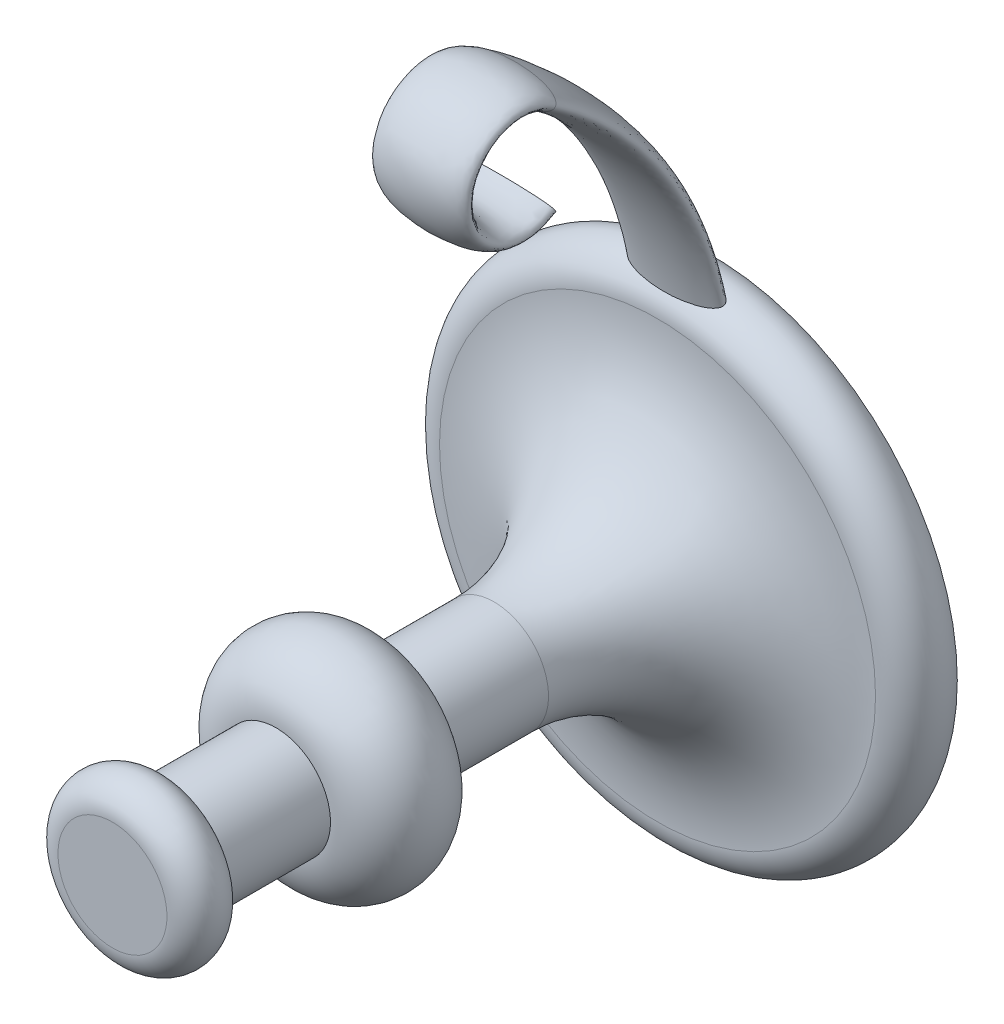
ISO-10303-21;
HEADER;
FILE_DESCRIPTION(('STEP AP214'),'2;1');
FILE_NAME('part.step','',(''),(''),'','','');
FILE_SCHEMA(('AUTOMOTIVE_DESIGN { 1 0 10303 214 1 1 1 1 }'));
ENDSEC;
DATA;
#1=APPLICATION_CONTEXT('core data for automotive mechanical design processes');
#2=APPLICATION_PROTOCOL_DEFINITION('international standard','automotive_design',2000,#1);
#3=PRODUCT_CONTEXT('',#1,'mechanical');
#4=PRODUCT('Part','Part','',(#3));
#5=PRODUCT_RELATED_PRODUCT_CATEGORY('part','',(#4));
#6=PRODUCT_DEFINITION_FORMATION('','',#4);
#7=PRODUCT_DEFINITION_CONTEXT('part definition',#1,'design');
#8=PRODUCT_DEFINITION('design','',#6,#7);
#9=PRODUCT_DEFINITION_SHAPE('','',#8);
#10=(LENGTH_UNIT() NAMED_UNIT(*) SI_UNIT(.MILLI.,.METRE.));
#11=(NAMED_UNIT(*) PLANE_ANGLE_UNIT() SI_UNIT($,.RADIAN.));
#12=(NAMED_UNIT(*) SI_UNIT($,.STERADIAN.) SOLID_ANGLE_UNIT());
#13=UNCERTAINTY_MEASURE_WITH_UNIT(LENGTH_MEASURE(1.E-05),#10,'distance_accuracy_value','');
#14=(GEOMETRIC_REPRESENTATION_CONTEXT(3) GLOBAL_UNCERTAINTY_ASSIGNED_CONTEXT((#13)) GLOBAL_UNIT_ASSIGNED_CONTEXT((#10,
#11,#12)) REPRESENTATION_CONTEXT('',''));
#15=CARTESIAN_POINT('',(0.,0.,0.));
#16=DIRECTION('',(0.,0.,1.));
#17=DIRECTION('',(1.,0.,0.));
#18=AXIS2_PLACEMENT_3D('',#15,#16,#17);
#19=CARTESIAN_POINT('',(0.,0.,0.));
#20=DIRECTION('',(0.,0.,-1.));
#21=DIRECTION('',(-1.,0.,0.));
#22=AXIS2_PLACEMENT_3D('',#19,#20,#21);
#23=PLANE('',#22);
#24=CARTESIAN_POINT('',(0.,0.,0.));
#25=DIRECTION('',(0.,0.,-1.));
#26=DIRECTION('',(-1.,0.,0.));
#27=AXIS2_PLACEMENT_3D('',#24,#25,#26);
#28=CIRCLE('',#27,90.);
#29=CARTESIAN_POINT('',(-90.,0.,0.));
#30=VERTEX_POINT('',#29);
#31=EDGE_CURVE('E72',#30,#30,#28,.T.);
#32=ORIENTED_EDGE('',*,*,#31,.T.);
#33=EDGE_LOOP('',(#32));
#34=FACE_BOUND('',#33,.T.);
#35=ADVANCED_FACE('F39',(#34),#23,.T.);
#36=CARTESIAN_POINT('',(0.,0.,220.));
#37=DIRECTION('',(0.,0.,1.));
#38=DIRECTION('',(1.,0.,0.));
#39=AXIS2_PLACEMENT_3D('',#36,#37,#38);
#40=PLANE('',#39);
#41=CARTESIAN_POINT('',(0.,0.,220.));
#42=DIRECTION('',(0.,0.,-1.));
#43=DIRECTION('',(-1.,0.,0.));
#44=AXIS2_PLACEMENT_3D('',#41,#42,#43);
#45=CIRCLE('',#44,20.);
#46=CARTESIAN_POINT('',(-20.,0.,220.));
#47=VERTEX_POINT('',#46);
#48=EDGE_CURVE('E50',#47,#47,#45,.T.);
#49=ORIENTED_EDGE('',*,*,#48,.F.);
#50=EDGE_LOOP('',(#49));
#51=FACE_BOUND('',#50,.T.);
#52=ADVANCED_FACE('F100',(#51),#40,.T.);
#53=CARTESIAN_POINT('',(0.,0.,210.));
#54=DIRECTION('',(0.,0.,-1.));
#55=DIRECTION('',(-1.,0.,0.));
#56=AXIS2_PLACEMENT_3D('',#53,#54,#55);
#57=TOROIDAL_SURFACE('',#56,20.,10.);
#58=ORIENTED_EDGE('',*,*,#48,.T.);
#59=EDGE_LOOP('',(#58));
#60=FACE_BOUND('',#59,.T.);
#61=CARTESIAN_POINT('',(0.,0.,200.));
#62=DIRECTION('',(0.,0.,-1.));
#63=DIRECTION('',(-1.,0.,0.));
#64=AXIS2_PLACEMENT_3D('',#61,#62,#63);
#65=CIRCLE('',#64,20.);
#66=CARTESIAN_POINT('',(-20.,0.,200.));
#67=VERTEX_POINT('',#66);
#68=EDGE_CURVE('E54',#67,#67,#65,.T.);
#69=ORIENTED_EDGE('',*,*,#68,.F.);
#70=EDGE_LOOP('',(#69));
#71=FACE_BOUND('',#70,.T.);
#72=ADVANCED_FACE('F105',(#60,#71),#57,.T.);
#73=CARTESIAN_POINT('',(0.,0.,0.));
#74=DIRECTION('',(0.,0.,-1.));
#75=DIRECTION('',(-1.,0.,0.));
#76=AXIS2_PLACEMENT_3D('',#73,#74,#75);
#77=CYLINDRICAL_SURFACE('',#76,20.);
#78=ORIENTED_EDGE('',*,*,#68,.T.);
#79=EDGE_LOOP('',(#78));
#80=FACE_BOUND('',#79,.T.);
#81=CARTESIAN_POINT('',(0.,0.,160.));
#82=DIRECTION('',(0.,0.,-1.));
#83=DIRECTION('',(-1.,0.,0.));
#84=AXIS2_PLACEMENT_3D('',#81,#82,#83);
#85=CIRCLE('',#84,20.);
#86=CARTESIAN_POINT('',(-20.,0.,160.));
#87=VERTEX_POINT('',#86);
#88=EDGE_CURVE('E58',#87,#87,#85,.T.);
#89=ORIENTED_EDGE('',*,*,#88,.F.);
#90=EDGE_LOOP('',(#89));
#91=FACE_BOUND('',#90,.T.);
#92=ADVANCED_FACE('F127',(#80,#91),#77,.T.);
#93=CARTESIAN_POINT('',(0.,0.,140.));
#94=DIRECTION('',(0.,0.,-1.));
#95=DIRECTION('',(-1.,0.,0.));
#96=AXIS2_PLACEMENT_3D('',#93,#94,#95);
#97=TOROIDAL_SURFACE('',#96,20.,20.);
#98=ORIENTED_EDGE('',*,*,#88,.T.);
#99=EDGE_LOOP('',(#98));
#100=FACE_BOUND('',#99,.T.);
#101=CARTESIAN_POINT('',(0.,0.,120.));
#102=DIRECTION('',(0.,0.,-1.));
#103=DIRECTION('',(-1.,0.,0.));
#104=AXIS2_PLACEMENT_3D('',#101,#102,#103);
#105=CIRCLE('',#104,20.);
#106=CARTESIAN_POINT('',(-20.,0.,120.));
#107=VERTEX_POINT('',#106);
#108=EDGE_CURVE('E63',#107,#107,#105,.T.);
#109=ORIENTED_EDGE('',*,*,#108,.F.);
#110=EDGE_LOOP('',(#109));
#111=FACE_BOUND('',#110,.T.);
#112=ADVANCED_FACE('F123',(#100,#111),#97,.T.);
#113=CARTESIAN_POINT('',(0.,0.,0.));
#114=DIRECTION('',(0.,0.,-1.));
#115=DIRECTION('',(-1.,0.,0.));
#116=AXIS2_PLACEMENT_3D('',#113,#114,#115);
#117=CYLINDRICAL_SURFACE('',#116,20.);
#118=ORIENTED_EDGE('',*,*,#108,.T.);
#119=EDGE_LOOP('',(#118));
#120=FACE_BOUND('',#119,.T.);
#121=CARTESIAN_POINT('',(0.,0.,80.));
#122=DIRECTION('',(0.,0.,-1.));
#123=DIRECTION('',(-1.,0.,0.));
#124=AXIS2_PLACEMENT_3D('',#121,#122,#123);
#125=CIRCLE('',#124,20.);
#126=CARTESIAN_POINT('',(-20.,0.,80.));
#127=VERTEX_POINT('',#126);
#128=EDGE_CURVE('E66',#127,#127,#125,.T.);
#129=ORIENTED_EDGE('',*,*,#128,.F.);
#130=EDGE_LOOP('',(#129));
#131=FACE_BOUND('',#130,.T.);
#132=ADVANCED_FACE('F115',(#120,#131),#117,.T.);
#133=CARTESIAN_POINT('',(0.,0.,80.));
#134=DIRECTION('',(0.,0.,-1.));
#135=DIRECTION('',(-1.,0.,0.));
#136=AXIS2_PLACEMENT_3D('',#133,#134,#135);
#137=TOROIDAL_SURFACE('',#136,80.,60.);
#138=ORIENTED_EDGE('',*,*,#128,.T.);
#139=EDGE_LOOP('',(#138));
#140=FACE_BOUND('',#139,.T.);
#141=CARTESIAN_POINT('',(0.,0.,20.));
#142=DIRECTION('',(0.,0.,-1.));
#143=DIRECTION('',(-1.,0.,0.));
#144=AXIS2_PLACEMENT_3D('',#141,#142,#143);
#145=CIRCLE('',#144,80.);
#146=CARTESIAN_POINT('',(-80.,0.,20.));
#147=VERTEX_POINT('',#146);
#148=EDGE_CURVE('E69',#147,#147,#145,.T.);
#149=ORIENTED_EDGE('',*,*,#148,.F.);
#150=EDGE_LOOP('',(#149));
#151=FACE_BOUND('',#150,.T.);
#152=ADVANCED_FACE('F110',(#140,#151),#137,.F.);
#153=CARTESIAN_POINT('',(0.,0.,7.50000000000004));
#154=DIRECTION('',(0.,0.,-1.));
#155=DIRECTION('',(-1.,0.,0.));
#156=AXIS2_PLACEMENT_3D('',#153,#154,#155);
#157=TOROIDAL_SURFACE('',#156,80.,12.5);
#158=CARTESIAN_POINT('',(17.5,89.5597422043342,12.9414346567555));
#159=CARTESIAN_POINT('',(17.5000019534777,89.5807278946486,12.8988393157081));
#160=CARTESIAN_POINT('',(17.4977816975197,89.6018125795404,12.8563039357769));
#161=CARTESIAN_POINT('',(17.489002543543,89.6440155813562,12.771693833937));
#162=CARTESIAN_POINT('',(17.4824425050804,89.6651339056647,12.7296192360718));
#163=CARTESIAN_POINT('',(17.4565216692095,89.728328929782,12.6045076597417));
#164=CARTESIAN_POINT('',(17.4309204730635,89.7702246464786,12.5226255894255));
#165=CARTESIAN_POINT('',(17.3563532007827,89.8644276523312,12.3407735771966));
#166=CARTESIAN_POINT('',(17.3027527423027,89.916211748319,12.242484901666));
#167=CARTESIAN_POINT('',(17.178826321144,90.0163878681401,12.0551458272008));
#168=CARTESIAN_POINT('',(17.1084587296402,90.0647710548456,11.966119226993));
#169=CARTESIAN_POINT('',(16.9652391551481,90.1524531790239,11.806984522925));
#170=CARTESIAN_POINT('',(16.8936963434585,90.1921458014336,11.7358878994478));
#171=CARTESIAN_POINT('',(16.7438969488311,90.2690886261225,11.5996259068224));
#172=CARTESIAN_POINT('',(16.665634722265,90.3063367280021,11.5344656201532));
#173=CARTESIAN_POINT('',(16.5039763875564,90.3786756485819,11.4092540815105));
#174=CARTESIAN_POINT('',(16.4205713158719,90.4137624747615,11.349212210629));
#175=CARTESIAN_POINT('',(16.2499454917114,90.4819450166471,11.2336894025402));
#176=CARTESIAN_POINT('',(16.162725848809,90.5150413047902,11.1782071523835));
#177=CARTESIAN_POINT('',(15.9728919395736,90.5839705930101,11.0637251825689));
#178=CARTESIAN_POINT('',(15.8698282905887,90.6195406839562,11.0053156128849));
#179=CARTESIAN_POINT('',(15.6606649910658,90.6886668526269,10.8929143897208));
#180=CARTESIAN_POINT('',(15.5545649910506,90.7222226971282,10.8389232475745));
#181=CARTESIAN_POINT('',(15.3401290691865,90.787486486134,10.7348751403119));
#182=CARTESIAN_POINT('',(15.2317969483067,90.8191972688173,10.6848120890841));
#183=CARTESIAN_POINT('',(15.0131968985225,90.881005962979,10.5880683385414));
#184=CARTESIAN_POINT('',(14.9029290865686,90.9111039714558,10.5413874357516));
#185=CARTESIAN_POINT('',(14.6427529331226,90.9798973633521,10.4355491517098));
#186=CARTESIAN_POINT('',(14.4922012075481,91.0180072010884,10.377593665576));
#187=CARTESIAN_POINT('',(14.1888070722871,91.0918875553169,10.2663462891692));
#188=CARTESIAN_POINT('',(14.0359643425398,91.1276577411367,10.2130550577559));
#189=CARTESIAN_POINT('',(13.7282685712581,91.1971197458645,10.1105127689612));
#190=CARTESIAN_POINT('',(13.573413471871,91.2308091946811,10.0612662985098));
#191=CARTESIAN_POINT('',(13.262180104172,91.2962483962878,9.96642044574797));
#192=CARTESIAN_POINT('',(13.1058017385396,91.3279980241889,9.92082129819992));
#193=CARTESIAN_POINT('',(12.6346162266685,91.4205951755327,9.78887458660798));
#194=CARTESIAN_POINT('',(12.3179025042442,91.4787589060981,9.70742476979594));
#195=CARTESIAN_POINT('',(11.6792188898601,91.5890957852254,9.55493826130151));
#196=CARTESIAN_POINT('',(11.3572303186109,91.641236506382,9.48395741425905));
#197=CARTESIAN_POINT('',(10.7107316640823,91.7397682682944,9.35136221163196));
#198=CARTESIAN_POINT('',(10.3862236929834,91.7861636672357,9.28974074823245));
#199=CARTESIAN_POINT('',(9.73512886653567,91.8736976604511,9.17463718318052));
#200=CARTESIAN_POINT('',(9.40854234516813,91.9148370779327,9.12115380666535));
#201=CARTESIAN_POINT('',(8.74630339912612,91.9930777751443,9.02031209920317));
#202=CARTESIAN_POINT('',(8.41061269264335,92.0300669877613,8.9731192113716));
#203=CARTESIAN_POINT('',(7.73783252743942,92.0991833927575,8.88559842477434));
#204=CARTESIAN_POINT('',(7.40074301754609,92.1313104056236,8.84527077946751));
#205=CARTESIAN_POINT('',(6.72537142355343,92.1909161961866,8.77092313439267));
#206=CARTESIAN_POINT('',(6.38708904887189,92.2183937480206,8.73690479789182));
#207=CARTESIAN_POINT('',(5.70964427774287,92.2688480816039,8.67476840304501));
#208=CARTESIAN_POINT('',(5.37048185250296,92.2918247141674,8.64665054027192));
#209=CARTESIAN_POINT('',(4.35367181244665,92.3540877228586,8.57076604630486));
#210=CARTESIAN_POINT('',(3.67498389641644,92.3868571977359,8.53128338370555));
#211=CARTESIAN_POINT('',(2.31614711504067,92.4356134743347,8.47274161832895));
#212=CARTESIAN_POINT('',(1.63599821506821,92.4515998737813,8.45368300509715));
#213=CARTESIAN_POINT('',(0.35795510233192,92.4661200478781,8.43637339284853));
#214=CARTESIAN_POINT('',(-0.239888856143677,92.4665389208555,8.43587490179706));
#215=CARTESIAN_POINT('',(-1.43536153859166,92.4546362797529,8.4500624126083));
#216=CARTESIAN_POINT('',(-2.03299021814842,92.4423128974783,8.46475064105845));
#217=CARTESIAN_POINT('',(-3.22745109478543,92.4047541650815,8.5097668077993));
#218=CARTESIAN_POINT('',(-3.82428298010724,92.379514731688,8.54009969200438));
#219=CARTESIAN_POINT('',(-5.01694606233259,92.3157217367253,8.61743320229676));
#220=CARTESIAN_POINT('',(-5.61277493756128,92.2771508465328,8.66445552395919));
#221=CARTESIAN_POINT('',(-6.80153886380937,92.1861026743767,8.77678784246256));
#222=CARTESIAN_POINT('',(-7.39447462535088,92.1336290020919,8.842093092625));
#223=CARTESIAN_POINT('',(-8.2805522982051,92.0437550848419,8.95574227206711));
#224=CARTESIAN_POINT('',(-8.57528682166723,92.0119455213755,8.99622894552014));
#225=CARTESIAN_POINT('',(-9.1634609442888,91.9444204496405,9.08291539794888));
#226=CARTESIAN_POINT('',(-9.4569005992671,91.9087051114865,9.12911492811457));
#227=CARTESIAN_POINT('',(-10.0422906036683,91.8331309715697,9.22782929334067));
#228=CARTESIAN_POINT('',(-10.3342404073468,91.7932707518514,9.28034629056381));
#229=CARTESIAN_POINT('',(-10.9161852811052,91.709117916737,9.39245062081629));
#230=CARTESIAN_POINT('',(-11.2061801005452,91.6648247441272,9.45203884286029));
#231=CARTESIAN_POINT('',(-11.7838191658168,91.5713925727481,9.57931645333879));
#232=CARTESIAN_POINT('',(-12.0714617643072,91.5222504482682,9.64701107336924));
#233=CARTESIAN_POINT('',(-12.6430805537631,91.4186796874406,9.79172730085905));
#234=CARTESIAN_POINT('',(-12.9270606150354,91.3642572573635,9.86873798424094));
#235=CARTESIAN_POINT('',(-13.4904217181465,91.2493765391175,10.033952974788));
#236=CARTESIAN_POINT('',(-13.7698049377447,91.1889212109097,10.1221517983454));
#237=CARTESIAN_POINT('',(-14.1839125047645,91.0929373870874,10.2648274882363));
#238=CARTESIAN_POINT('',(-14.3210581267386,91.0600757486262,10.3140904181849));
#239=CARTESIAN_POINT('',(-14.5933763477648,90.9923938569386,10.4165511027191));
#240=CARTESIAN_POINT('',(-14.7285491237343,90.9575737807136,10.4697485018483));
#241=CARTESIAN_POINT('',(-15.0138774923677,90.8810851838776,10.5878451344079));
#242=CARTESIAN_POINT('',(-15.1636969104748,90.8391147723957,10.6533666208412));
#243=CARTESIAN_POINT('',(-15.45932953559,90.7519625692612,10.7912189771815));
#244=CARTESIAN_POINT('',(-15.6051410149849,90.7067794219569,10.8635527258308));
#245=CARTESIAN_POINT('',(-15.8905749729623,90.6128939496975,11.0160439629677));
#246=CARTESIAN_POINT('',(-16.0302224467125,90.5642084544311,11.0961646105686));
#247=CARTESIAN_POINT('',(-16.3016394850687,90.4624897667353,11.2662530107873));
#248=CARTESIAN_POINT('',(-16.4334173639364,90.4094613083907,11.3562100760682));
#249=CARTESIAN_POINT('',(-16.6553108138959,90.3114276481005,11.5255085385048));
#250=CARTESIAN_POINT('',(-16.747864447136,90.2675273757817,11.6022608890606));
#251=CARTESIAN_POINT('',(-16.9236630994732,90.1761749534326,11.7643292238687));
#252=CARTESIAN_POINT('',(-17.0068929161981,90.1287172073378,11.849658775493));
#253=CARTESIAN_POINT('',(-17.160728121925,90.0292807633426,12.0313291797368));
#254=CARTESIAN_POINT('',(-17.2311575389091,89.9772518064337,12.1277974407354));
#255=CARTESIAN_POINT('',(-17.3212876850735,89.8965437818878,12.2800613987942));
#256=CARTESIAN_POINT('',(-17.3487242132161,89.8692277989253,12.3320164153137));
#257=CARTESIAN_POINT('',(-17.3975211145679,89.8138320311432,12.4382955168478));
#258=CARTESIAN_POINT('',(-17.418885167671,89.7857527202502,12.4926181439798));
#259=CARTESIAN_POINT('',(-17.4611772226903,89.7185869780335,12.6237048005598));
#260=CARTESIAN_POINT('',(-17.4790502108363,89.6792533408887,12.7013692224276));
#261=CARTESIAN_POINT('',(-17.4997317533412,89.6005512815565,12.8586256339485));
#262=CARTESIAN_POINT('',(-17.5025524785485,89.5611829132234,12.9382160139949));
#263=CARTESIAN_POINT('',(-17.4927372657774,89.4835317885697,13.0969633423244));
#264=CARTESIAN_POINT('',(-17.4801006306501,89.4452490812937,13.1761202708964));
#265=CARTESIAN_POINT('',(-17.440649407729,89.3707047667355,13.3318071774563));
#266=CARTESIAN_POINT('',(-17.4138201116179,89.3344452993771,13.4083343423531));
#267=CARTESIAN_POINT('',(-17.3357126521072,89.2510611220235,13.5858554385682));
#268=CARTESIAN_POINT('',(-17.2790047620841,89.2050998650832,13.684982377722));
#269=CARTESIAN_POINT('',(-17.1491670423827,89.1180744174557,13.8744276311819));
#270=CARTESIAN_POINT('',(-17.0759737821298,89.0770301058259,13.9647099356686));
#271=CARTESIAN_POINT('',(-16.927057730704,89.0037033744712,14.127143485757));
#272=CARTESIAN_POINT('',(-16.8525208708987,88.9709541551904,14.2001945680732));
#273=CARTESIAN_POINT('',(-16.6970292692111,88.9084968426191,14.3401811690449));
#274=CARTESIAN_POINT('',(-16.6160846261893,88.8787841266134,14.4071259665769));
#275=CARTESIAN_POINT('',(-16.4490709627679,88.821781438855,14.5359995630882));
#276=CARTESIAN_POINT('',(-16.3629857823211,88.7944998605827,14.5979109242411));
#277=CARTESIAN_POINT('',(-16.1870697873632,88.742066743737,14.7171734064659));
#278=CARTESIAN_POINT('',(-16.0972377082952,88.7169159331092,14.77452296866));
#279=CARTESIAN_POINT('',(-15.9140699306464,88.6682699235337,14.8855899090512));
#280=CARTESIAN_POINT('',(-15.8207148279061,88.6447869137157,14.9392804489425));
#281=CARTESIAN_POINT('',(-15.6316626961435,88.5993971939428,15.0431008843881));
#282=CARTESIAN_POINT('',(-15.5359652603526,88.5774907604159,15.0932301555101));
#283=CARTESIAN_POINT('',(-15.2458062448789,88.5137514786221,15.2390285874185));
#284=CARTESIAN_POINT('',(-15.0485147207849,88.4739596847914,15.3299685477358));
#285=CARTESIAN_POINT('',(-14.648715263339,88.3985337506616,15.5017775203625));
#286=CARTESIAN_POINT('',(-14.4462032813476,88.362902963484,15.582638414004));
#287=CARTESIAN_POINT('',(-14.0365764701693,88.2948356711213,15.7363066128671));
#288=CARTESIAN_POINT('',(-13.8294450545353,88.262414229517,15.8090761199815));
#289=CARTESIAN_POINT('',(-13.4126289871764,88.2003835751382,15.9473648801956));
#290=CARTESIAN_POINT('',(-13.2029472733586,88.1707714189815,16.0128917338222));
#291=CARTESIAN_POINT('',(-12.7814949946304,88.1139049361938,16.137737574562));
#292=CARTESIAN_POINT('',(-12.5697249473631,88.0866500408509,16.1970580597503));
#293=CARTESIAN_POINT('',(-12.0912931700781,88.027617257203,16.3244235662304));
#294=CARTESIAN_POINT('',(-11.8241540502347,87.9964138193045,16.3909381265494));
#295=CARTESIAN_POINT('',(-11.2878278414652,87.9367717636618,16.5165936764719));
#296=CARTESIAN_POINT('',(-11.0186405549276,87.9083334164422,16.575733944766));
#297=CARTESIAN_POINT('',(-10.4785408424886,87.8539266282973,16.6875098948957));
#298=CARTESIAN_POINT('',(-10.2076276543196,87.8279593730488,16.7401424577995));
#299=CARTESIAN_POINT('',(-9.66451167999858,87.7783184309332,16.8395301522936));
#300=CARTESIAN_POINT('',(-9.39230883453954,87.7546448506397,16.8862850108117));
#301=CARTESIAN_POINT('',(-8.57578965921822,87.6869994555326,17.0182803050948));
#302=CARTESIAN_POINT('',(-8.02991167225489,87.6462388525847,17.0955854003687));
#303=CARTESIAN_POINT('',(-6.93552385094039,87.5728065515612,17.2320145687302));
#304=CARTESIAN_POINT('',(-6.38701462498129,87.5401330675683,17.2911426566327));
#305=CARTESIAN_POINT('',(-5.28955884850948,87.4828441952972,17.3930876120974));
#306=CARTESIAN_POINT('',(-4.74061740412603,87.4582074588681,17.4359477429322));
#307=CARTESIAN_POINT('',(-3.64146108218797,87.4169410999173,17.5068884934701));
#308=CARTESIAN_POINT('',(-3.09124613761892,87.4003119088603,17.5349683167839));
#309=CARTESIAN_POINT('',(-1.98980868969329,87.375169948199,17.5771566462025));
#310=CARTESIAN_POINT('',(-1.43858580772245,87.3666614689744,17.5912577671532));
#311=CARTESIAN_POINT('',(-0.335909067646847,87.3578539704596,17.6058511840596));
#312=CARTESIAN_POINT('',(0.215544784623744,87.3575547550008,17.6063438052041));
#313=CARTESIAN_POINT('',(1.31815822776076,87.3651677510509,17.5937352162513));
#314=CARTESIAN_POINT('',(1.86931785044922,87.3730787250644,17.5806360547996));
#315=CARTESIAN_POINT('',(2.97097544677544,87.3970372477742,17.5404868292747));
#316=CARTESIAN_POINT('',(3.52147339794554,87.4130850653538,17.5134363041761));
#317=CARTESIAN_POINT('',(4.621121356666,87.4531996813081,17.4446213827577));
#318=CARTESIAN_POINT('',(5.17027166873947,87.4772644593791,17.4028606933021));
#319=CARTESIAN_POINT('',(6.26670053623329,87.533331677406,17.3033707612733));
#320=CARTESIAN_POINT('',(6.81397924959176,87.5653334299481,17.2456429015518));
#321=CARTESIAN_POINT('',(7.65503321383559,87.620822053123,17.1429049509087));
#322=CARTESIAN_POINT('',(7.94978028808692,87.6414679669259,17.1042333246743));
#323=CARTESIAN_POINT('',(8.53829462762041,87.6851649593455,17.0212250701556));
#324=CARTESIAN_POINT('',(8.83206192119723,87.708215967875,16.976888606943));
#325=CARTESIAN_POINT('',(9.41827197236726,87.7568106691336,16.8820510369682));
#326=CARTESIAN_POINT('',(9.71071522164681,87.7823533406,16.8315524537748));
#327=CARTESIAN_POINT('',(10.2940938312737,87.8360989952264,16.7237193681052));
#328=CARTESIAN_POINT('',(10.5850292408463,87.8643018909556,16.6663850902744));
#329=CARTESIAN_POINT('',(11.0784529887212,87.9147712499547,16.5622842610507));
#330=CARTESIAN_POINT('',(11.2814293835323,87.9362980252953,16.5174691899792));
#331=CARTESIAN_POINT('',(11.6862455623065,87.9809118301303,16.4236835134754));
#332=CARTESIAN_POINT('',(11.8880853805181,88.0039988123353,16.3747130339806));
#333=CARTESIAN_POINT('',(12.2905621648834,88.0519198244942,16.2721215384763));
#334=CARTESIAN_POINT('',(12.4911979528404,88.0767553337323,16.2184965755432));
#335=CARTESIAN_POINT('',(12.8907612736828,88.1283787004667,16.1060707847342));
#336=CARTESIAN_POINT('',(13.0896888629011,88.1551664933022,16.0472701282667));
#337=CARTESIAN_POINT('',(13.4854201231402,88.2109999780503,15.9237718205579));
#338=CARTESIAN_POINT('',(13.6822235567001,88.2400459194857,15.8590735174968));
#339=CARTESIAN_POINT('',(14.0730419872888,88.3008027999432,15.7228691935855));
#340=CARTESIAN_POINT('',(14.2670572552393,88.3325134779583,15.6513638393847));
#341=CARTESIAN_POINT('',(14.651197359113,88.3991424541959,15.5003948115862));
#342=CARTESIAN_POINT('',(14.8413258930654,88.4340575115815,15.4209391715429));
#343=CARTESIAN_POINT('',(15.2164401400164,88.5079196083048,15.2523848762568));
#344=CARTESIAN_POINT('',(15.4014281468486,88.5468648114129,15.1632906117652));
#345=CARTESIAN_POINT('',(15.6733114229638,88.6092096238851,15.0206579718872));
#346=CARTESIAN_POINT('',(15.7630166800367,88.6306485895101,14.9716086740027));
#347=CARTESIAN_POINT('',(15.9401002079369,88.6750422753312,14.8701248615223));
#348=CARTESIAN_POINT('',(16.0274788777595,88.6979967332496,14.8176909327201));
#349=CARTESIAN_POINT('',(16.199388756713,88.7456840101799,14.7089478844276));
#350=CARTESIAN_POINT('',(16.283918089254,88.770417968827,14.6526362825894));
#351=CARTESIAN_POINT('',(16.4492391224751,88.8219484857479,14.5356422617906));
#352=CARTESIAN_POINT('',(16.5300317386028,88.8487445345048,14.4749609227746));
#353=CARTESIAN_POINT('',(16.6667168433048,88.8976102788187,14.3647434848951));
#354=CARTESIAN_POINT('',(16.7236955334943,88.919137419161,14.3163230322082));
#355=CARTESIAN_POINT('',(16.8342912802672,88.9637080676468,14.216445298216));
#356=CARTESIAN_POINT('',(16.8879075056815,88.9867519478514,14.1649872721064));
#357=CARTESIAN_POINT('',(17.0423310846553,89.0583610181501,14.0058008216799));
#358=CARTESIAN_POINT('',(17.1370796109723,89.1095289234104,13.8929758416958));
#359=CARTESIAN_POINT('',(17.2707956184664,89.1999001554574,13.6963386208976));
#360=CARTESIAN_POINT('',(17.3175503480629,89.2367505169321,13.6167644879684));
#361=CARTESIAN_POINT('',(17.3968468737185,89.313687765385,13.4522974166013));
#362=CARTESIAN_POINT('',(17.429422083718,89.3537667767867,13.3674175273967));
#363=CARTESIAN_POINT('',(17.4685967336683,89.4217091217893,13.2251848973543));
#364=CARTESIAN_POINT('',(17.4803204652976,89.448809384098,13.1688551716177));
#365=CARTESIAN_POINT('',(17.4960211898048,89.5037947740349,13.0554594934972));
#366=CARTESIAN_POINT('',(17.499997387795,89.5316799819,12.9983934661741));
#367=CARTESIAN_POINT('',(17.5,89.5597422043342,12.9414346567555));
#368=B_SPLINE_CURVE_WITH_KNOTS('',3,(#158,#159,#160,#161,#162,#163,#164,#165,#166,#167,#168,
#169,#170,#171,#172,#173,#174,#175,#176,#177,#178,#179,#180,#181,#182,#183,#184,#185,#186,#187,
#188,#189,#190,#191,#192,#193,#194,#195,#196,#197,#198,#199,#200,#201,#202,#203,#204,#205,#206,
#207,#208,#209,#210,#211,#212,#213,#214,#215,#216,#217,#218,#219,#220,#221,#222,#223,#224,#225,
#226,#227,#228,#229,#230,#231,#232,#233,#234,#235,#236,#237,#238,#239,#240,#241,#242,#243,#244,
#245,#246,#247,#248,#249,#250,#251,#252,#253,#254,#255,#256,#257,#258,#259,#260,#261,#262,#263,
#264,#265,#266,#267,#268,#269,#270,#271,#272,#273,#274,#275,#276,#277,#278,#279,#280,#281,#282,
#283,#284,#285,#286,#287,#288,#289,#290,#291,#292,#293,#294,#295,#296,#297,#298,#299,#300,#301,
#302,#303,#304,#305,#306,#307,#308,#309,#310,#311,#312,#313,#314,#315,#316,#317,#318,#319,#320,
#321,#322,#323,#324,#325,#326,#327,#328,#329,#330,#331,#332,#333,#334,#335,#336,#337,#338,#339,
#340,#341,#342,#343,#344,#345,#346,#347,#348,#349,#350,#351,#352,#353,#354,#355,#356,#357,#358,
#359,#360,#361,#362,#363,#364,#365,#366,#367),.UNSPECIFIED.,.T.,.F.,(4,2,2,2,2,2,2,2,2,2,2,2,2,
2,2,2,2,2,2,2,2,2,2,2,2,2,2,2,2,2,2,2,2,2,2,2,2,2,2,2,2,2,2,2,2,2,2,2,2,2,2,2,2,2,2,2,2,2,2,2,2,
2,2,2,2,2,2,2,2,2,2,2,2,2,2,2,2,2,2,2,2,2,2,2,2,2,2,2,2,2,2,2,2,2,2,2,2,2,2,2,2,2,2,2,4),(0.,
0.142381357158825,0.284800145338805,0.569778369710395,0.937790990160512,1.30672699797602,
1.63143353328551,1.95641550824169,2.28198085179474,2.60745211744528,2.97835758825746,
3.34930592253142,3.71966767593574,4.09000712931064,4.58717127025777,5.08440552627603,
5.5821960973042,6.08001868322204,7.07612740491149,8.07737111401417,9.07785060328478,
10.078173201863,11.1010679437462,12.1240004418369,13.1472022244407,14.1704379160043,
16.2117115539474,18.2530341182273,20.0462457692419,21.839720367684,23.6337623045226,
25.4301450150664,27.2260617741974,28.1235892294177,29.0210776087003,29.9188740333846,
30.8167834514321,31.715275504992,32.6127240115717,33.5097343419003,33.9578247270814,
34.4058746792328,34.9121604747937,35.4186611861169,35.9228725276491,36.4265413835618,
36.8100240505595,37.1941231504199,37.5831580539592,37.7772586450041,37.9712413599168,
38.2366258142317,38.5017956533799,38.7669774525069,39.0324346081147,39.3996555983548,
39.768314439312,40.0959866375239,40.4231523204127,40.7514069982211,41.0797733710075,
41.4103344436377,41.7409533344651,42.4030339566268,43.065644483573,43.7312306850948,
44.3961116446151,45.0608317450499,45.8918608553074,46.7229711882495,47.5544783139751,
48.3860240564144,50.0440426041168,51.7016946763003,53.3549069476176,55.008208287844,
56.6623826267322,58.3165174374165,59.9704029618906,61.6243431428186,63.2778668395616,
64.9312473761649,65.8251617717389,66.7190501248677,67.6125736254197,68.5060677696824,
69.1329546330655,69.7598225042283,70.3872272415082,71.0146112082204,71.6420645989505,
72.2694566030651,72.8962209263444,73.522700927951,73.8360175198388,74.1492800292294,
74.4627449766591,74.7761327179489,75.0094189443188,75.2427626113339,75.7080186392215,
76.005244146511,76.3017654013238,76.4921392885517,76.6825327068868),.UNSPECIFIED.);
#369=CARTESIAN_POINT('',(17.5,89.5597422043342,12.9414346567555));
#370=VERTEX_POINT('',#369);
#371=EDGE_CURVE('E10',#370,#370,#368,.T.);
#372=ORIENTED_EDGE('',*,*,#371,.F.);
#373=EDGE_LOOP('',(#372));
#374=FACE_BOUND('',#373,.T.);
#375=ORIENTED_EDGE('',*,*,#148,.T.);
#376=EDGE_LOOP('',(#375));
#377=FACE_BOUND('',#376,.T.);
#378=ORIENTED_EDGE('',*,*,#31,.F.);
#379=EDGE_LOOP('',(#378));
#380=FACE_BOUND('',#379,.T.);
#381=ADVANCED_FACE('F93',(#374,#377,#380),#157,.T.);
#382=CARTESIAN_POINT('',(0.,150.634185358261,75.));
#383=DIRECTION('',(0.,0.566666666666666,-0.823947139620552));
#384=DIRECTION('',(0.,0.823947139620552,0.566666666666666));
#385=AXIS2_PLACEMENT_3D('',#382,#383,#384);
#386=PLANE('',#385);
#387=CARTESIAN_POINT('',(0.,150.634185358261,75.));
#388=DIRECTION('',(0.,0.566666666666666,-0.823947139620552));
#389=DIRECTION('',(1.,0.,0.));
#390=AXIS2_PLACEMENT_3D('',#387,#388,#389);
#391=ELLIPSE('',#390,17.5,5.);
#392=CARTESIAN_POINT('',(17.5,150.634185358261,75.));
#393=VERTEX_POINT('',#392);
#394=EDGE_CURVE('E75',#393,#393,#391,.T.);
#395=ORIENTED_EDGE('',*,*,#394,.T.);
#396=EDGE_LOOP('',(#395));
#397=FACE_BOUND('',#396,.T.);
#398=ADVANCED_FACE('F86',(#397),#386,.T.);
#399=CARTESIAN_POINT('',(17.5,60.,10.));
#400=CARTESIAN_POINT('',(17.5,110.410191303973,10.));
#401=CARTESIAN_POINT('',(17.5,155.026295870831,33.4646670673665));
#402=CARTESIAN_POINT('',(17.5,183.592070943083,75.));
#403=CARTESIAN_POINT('',(17.5,60.,0.));
#404=CARTESIAN_POINT('',(17.5,113.770870724238,0.));
#405=CARTESIAN_POINT('',(17.5,161.36138226222,25.0289782051909));
#406=CARTESIAN_POINT('',(17.5,191.831542339288,69.3333333333333));
#407=CARTESIAN_POINT('',(-17.5,60.,0.));
#408=CARTESIAN_POINT('',(-17.5,113.770870724238,0.));
#409=CARTESIAN_POINT('',(-17.5,161.36138226222,25.0289782051909));
#410=CARTESIAN_POINT('',(-17.5,191.831542339288,69.3333333333333));
#411=CARTESIAN_POINT('',(-17.5,60.,10.));
#412=CARTESIAN_POINT('',(-17.5,110.410191303973,10.));
#413=CARTESIAN_POINT('',(-17.5,155.026295870831,33.4646670673665));
#414=CARTESIAN_POINT('',(-17.5,183.592070943083,75.));
#415=CARTESIAN_POINT('',(-17.5,60.,20.));
#416=CARTESIAN_POINT('',(-17.5,107.049511883708,20.));
#417=CARTESIAN_POINT('',(-17.5,148.691209479443,41.9003559295421));
#418=CARTESIAN_POINT('',(-17.5,175.352599546877,80.6666666666667));
#419=CARTESIAN_POINT('',(17.5,60.,20.));
#420=CARTESIAN_POINT('',(17.5,107.049511883708,20.));
#421=CARTESIAN_POINT('',(17.5,148.691209479443,41.9003559295421));
#422=CARTESIAN_POINT('',(17.5,175.352599546877,80.6666666666667));
#423=CARTESIAN_POINT('',(17.5,60.,10.));
#424=CARTESIAN_POINT('',(17.5,110.410191303973,10.));
#425=CARTESIAN_POINT('',(17.5,155.026295870831,33.4646670673665));
#426=CARTESIAN_POINT('',(17.5,183.592070943083,75.));
#427=(BOUNDED_SURFACE() B_SPLINE_SURFACE(3,3,((#399,#400,#401,#402),(#403,#404,#405,#406),(#407,
#408,#409,#410),(#411,#412,#413,#414),(#415,#416,#417,#418),(#419,#420,#421,#422),(#423,#424,
#425,#426)),.UNSPECIFIED.,.T.,.F.,.F.) B_SPLINE_SURFACE_WITH_KNOTS((4,3,4),(4,4),(0.,0.5,1.),
(0.,1.),.UNSPECIFIED.) GEOMETRIC_REPRESENTATION_ITEM() RATIONAL_B_SPLINE_SURFACE(((1.,
0.923374135437856,0.923374135437856,1.),(0.333333333333333,0.307791378479285,0.307791378479285,
0.333333333333333),(0.333333333333333,0.307791378479285,0.307791378479285,0.333333333333333),
(1.,0.923374135437856,0.923374135437856,1.),(0.333333333333333,0.307791378479285,
0.307791378479285,0.333333333333333),(0.333333333333333,0.307791378479285,0.307791378479285,
0.333333333333333),(1.,0.923374135437856,0.923374135437856,1.))) REPRESENTATION_ITEM('') SURFACE());
#428=CARTESIAN_POINT('',(0.,183.592070943083,75.));
#429=DIRECTION('',(0.,0.566666666666667,0.823947139620552));
#430=DIRECTION('',(1.,0.,0.));
#431=AXIS2_PLACEMENT_3D('',#428,#429,#430);
#432=ELLIPSE('',#431,17.5,5.);
#433=CARTESIAN_POINT('',(17.5,183.592070943083,75.));
#434=VERTEX_POINT('',#433);
#435=EDGE_CURVE('E78',#434,#434,#432,.T.);
#436=ORIENTED_EDGE('',*,*,#371,.T.);
#437=EDGE_LOOP('',(#436));
#438=FACE_BOUND('',#437,.T.);
#439=ORIENTED_EDGE('',*,*,#435,.F.);
#440=EDGE_LOOP('',(#439));
#441=FACE_BOUND('',#440,.T.);
#442=ADVANCED_FACE('F84',(#438,#441),#427,.T.);
#443=CARTESIAN_POINT('',(17.5,183.592070943083,75.));
#444=CARTESIAN_POINT('',(17.5,193.981461744242,90.1064273523801));
#445=CARTESIAN_POINT('',(17.5,185.447347211541,106.333333333333));
#446=CARTESIAN_POINT('',(17.5,167.113128150672,106.333333333333));
#447=CARTESIAN_POINT('',(17.5,148.778909089802,106.333333333333));
#448=CARTESIAN_POINT('',(17.5,140.244794557101,90.1064273523801));
#449=CARTESIAN_POINT('',(17.5,150.634185358261,75.));
#450=CARTESIAN_POINT('',(17.5,191.831542339288,69.3333333333333));
#451=CARTESIAN_POINT('',(17.5,207.415628541027,91.9929743619035));
#452=CARTESIAN_POINT('',(17.5,194.614456741976,116.333333333333));
#453=CARTESIAN_POINT('',(17.5,167.113128150672,116.333333333333));
#454=CARTESIAN_POINT('',(17.5,139.611799559367,116.333333333333));
#455=CARTESIAN_POINT('',(17.5,126.810627760316,91.9929743619035));
#456=CARTESIAN_POINT('',(17.5,142.394713962055,69.3333333333334));
#457=CARTESIAN_POINT('',(-17.5,191.831542339288,69.3333333333333));
#458=CARTESIAN_POINT('',(-17.5,207.415628541027,91.9929743619035));
#459=CARTESIAN_POINT('',(-17.5,194.614456741976,116.333333333333));
#460=CARTESIAN_POINT('',(-17.5,167.113128150672,116.333333333333));
#461=CARTESIAN_POINT('',(-17.5,139.611799559367,116.333333333333));
#462=CARTESIAN_POINT('',(-17.5,126.810627760316,91.9929743619035));
#463=CARTESIAN_POINT('',(-17.5,142.394713962055,69.3333333333334));
#464=CARTESIAN_POINT('',(-17.5,183.592070943083,75.));
#465=CARTESIAN_POINT('',(-17.5,193.981461744242,90.1064273523801));
#466=CARTESIAN_POINT('',(-17.5,185.447347211541,106.333333333333));
#467=CARTESIAN_POINT('',(-17.5,167.113128150672,106.333333333333));
#468=CARTESIAN_POINT('',(-17.5,148.778909089802,106.333333333333));
#469=CARTESIAN_POINT('',(-17.5,140.244794557101,90.1064273523801));
#470=CARTESIAN_POINT('',(-17.5,150.634185358261,75.));
#471=CARTESIAN_POINT('',(-17.5,175.352599546877,80.6666666666667));
#472=CARTESIAN_POINT('',(-17.5,180.547294947457,88.2198803428567));
#473=CARTESIAN_POINT('',(-17.5,176.280237681107,96.3333333333333));
#474=CARTESIAN_POINT('',(-17.5,167.113128150672,96.3333333333333));
#475=CARTESIAN_POINT('',(-17.5,157.946018620237,96.3333333333334));
#476=CARTESIAN_POINT('',(-17.5,153.678961353887,88.2198803428567));
#477=CARTESIAN_POINT('',(-17.5,158.873656754466,80.6666666666667));
#478=CARTESIAN_POINT('',(17.5,175.352599546877,80.6666666666667));
#479=CARTESIAN_POINT('',(17.5,180.547294947457,88.2198803428567));
#480=CARTESIAN_POINT('',(17.5,176.280237681107,96.3333333333333));
#481=CARTESIAN_POINT('',(17.5,167.113128150672,96.3333333333333));
#482=CARTESIAN_POINT('',(17.5,157.946018620237,96.3333333333334));
#483=CARTESIAN_POINT('',(17.5,153.678961353887,88.2198803428567));
#484=CARTESIAN_POINT('',(17.5,158.873656754466,80.6666666666667));
#485=CARTESIAN_POINT('',(17.5,183.592070943083,75.));
#486=CARTESIAN_POINT('',(17.5,193.981461744242,90.1064273523801));
#487=CARTESIAN_POINT('',(17.5,185.447347211541,106.333333333333));
#488=CARTESIAN_POINT('',(17.5,167.113128150672,106.333333333333));
#489=CARTESIAN_POINT('',(17.5,148.778909089802,106.333333333333));
#490=CARTESIAN_POINT('',(17.5,140.244794557101,90.1064273523801));
#491=CARTESIAN_POINT('',(17.5,150.634185358261,75.));
#492=(BOUNDED_SURFACE() B_SPLINE_SURFACE(3,3,((#443,#444,#445,#446,#447,#448,#449),(#450,#451,
#452,#453,#454,#455,#456),(#457,#458,#459,#460,#461,#462,#463),(#464,#465,#466,#467,#468,#469,
#470),(#471,#472,#473,#474,#475,#476,#477),(#478,#479,#480,#481,#482,#483,#484),(#485,#486,#487,
#488,#489,#490,#491)),.UNSPECIFIED.,.T.,.F.,.F.) B_SPLINE_SURFACE_WITH_KNOTS((4,3,4),(4,3,4),
(0.,0.5,1.),(0.,0.5,1.),
.UNSPECIFIED.) GEOMETRIC_REPRESENTATION_ITEM() RATIONAL_B_SPLINE_SURFACE(((1.,0.643649778750421,
0.643649778750421,1.,0.643649778750421,0.643649778750421,1.),(0.333333333333333,
0.21454992625014,0.21454992625014,0.333333333333333,0.21454992625014,0.21454992625014,
0.333333333333333),(0.333333333333333,0.21454992625014,0.21454992625014,0.333333333333333,
0.21454992625014,0.21454992625014,0.333333333333333),(1.,0.643649778750421,0.643649778750421,1.,
0.643649778750421,0.643649778750421,1.),(0.333333333333333,0.21454992625014,0.21454992625014,
0.333333333333333,0.21454992625014,0.21454992625014,0.333333333333333),(0.333333333333333,
0.21454992625014,0.21454992625014,0.333333333333333,0.21454992625014,0.21454992625014,
0.333333333333333),(1.,0.643649778750421,0.643649778750421,1.,0.643649778750421,
0.643649778750421,1.))) REPRESENTATION_ITEM('') SURFACE());
#493=ORIENTED_EDGE('',*,*,#394,.F.);
#494=EDGE_LOOP('',(#493));
#495=FACE_BOUND('',#494,.T.);
#496=ORIENTED_EDGE('',*,*,#435,.T.);
#497=EDGE_LOOP('',(#496));
#498=FACE_BOUND('',#497,.T.);
#499=ADVANCED_FACE('F82',(#495,#498),#492,.T.);
#500=CLOSED_SHELL('',(#35,#52,#72,#92,#112,#132,#152,#381,#398,#442,#499));
#501=MANIFOLD_SOLID_BREP('B2',#500);
#502=ADVANCED_BREP_SHAPE_REPRESENTATION('',(#18,#501),#14);
#503=SHAPE_DEFINITION_REPRESENTATION(#9,#502);
ENDSEC;
END-ISO-10303-21;
